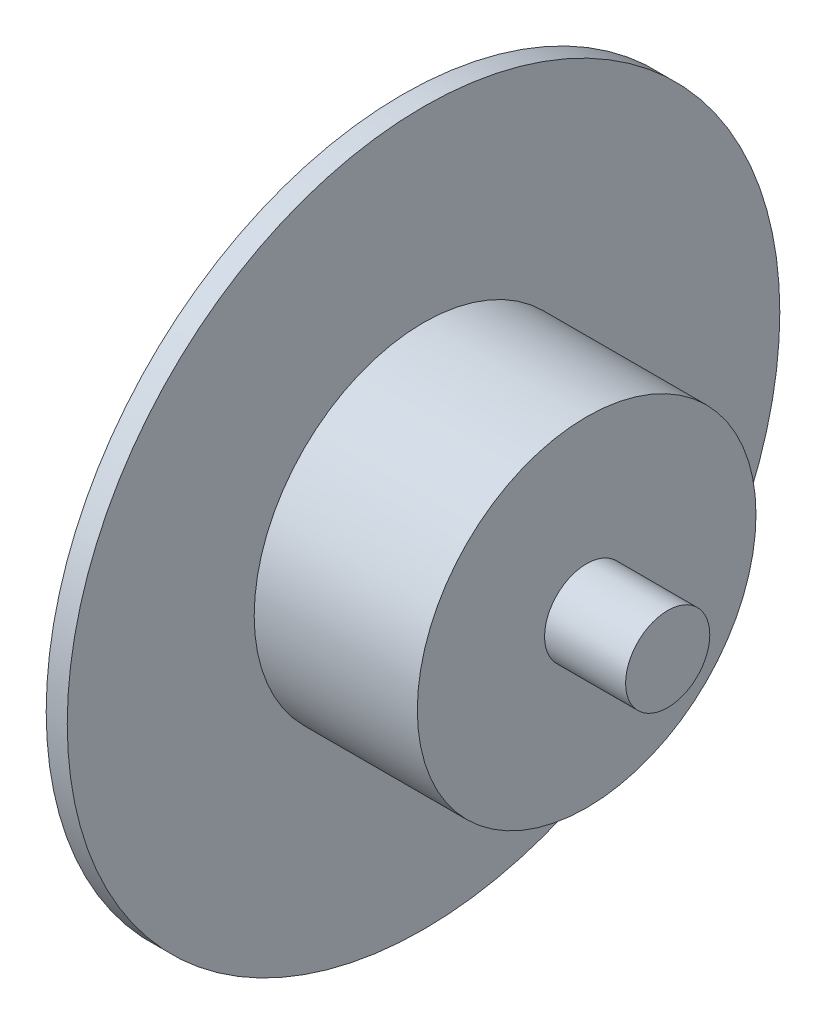
ISO-10303-21;
HEADER;
FILE_DESCRIPTION(('STEP AP214'),'2;1');
FILE_NAME('part.step','',(''),(''),'','','');
FILE_SCHEMA(('AUTOMOTIVE_DESIGN { 1 0 10303 214 1 1 1 1 }'));
ENDSEC;
DATA;
#1=APPLICATION_CONTEXT('core data for automotive mechanical design processes');
#2=APPLICATION_PROTOCOL_DEFINITION('international standard','automotive_design',2000,#1);
#3=PRODUCT_CONTEXT('',#1,'mechanical');
#4=PRODUCT('Part','Part','',(#3));
#5=PRODUCT_RELATED_PRODUCT_CATEGORY('part','',(#4));
#6=PRODUCT_DEFINITION_FORMATION('','',#4);
#7=PRODUCT_DEFINITION_CONTEXT('part definition',#1,'design');
#8=PRODUCT_DEFINITION('design','',#6,#7);
#9=PRODUCT_DEFINITION_SHAPE('','',#8);
#10=(LENGTH_UNIT() NAMED_UNIT(*) SI_UNIT(.MILLI.,.METRE.));
#11=(NAMED_UNIT(*) PLANE_ANGLE_UNIT() SI_UNIT($,.RADIAN.));
#12=(NAMED_UNIT(*) SI_UNIT($,.STERADIAN.) SOLID_ANGLE_UNIT());
#13=UNCERTAINTY_MEASURE_WITH_UNIT(LENGTH_MEASURE(1.E-05),#10,'distance_accuracy_value','');
#14=(GEOMETRIC_REPRESENTATION_CONTEXT(3) GLOBAL_UNCERTAINTY_ASSIGNED_CONTEXT((#13)) GLOBAL_UNIT_ASSIGNED_CONTEXT((#10,
#11,#12)) REPRESENTATION_CONTEXT('',''));
#15=CARTESIAN_POINT('',(0.,0.,0.));
#16=DIRECTION('',(0.,0.,1.));
#17=DIRECTION('',(1.,0.,0.));
#18=AXIS2_PLACEMENT_3D('',#15,#16,#17);
#19=CARTESIAN_POINT('',(-110.,0.,0.));
#20=DIRECTION('',(1.,0.,0.));
#21=DIRECTION('',(0.,0.,-1.));
#22=AXIS2_PLACEMENT_3D('',#19,#20,#21);
#23=CYLINDRICAL_SURFACE('',#22,169.268161275);
#24=CARTESIAN_POINT('',(-110.,0.,0.));
#25=DIRECTION('',(-1.,0.,0.));
#26=DIRECTION('',(0.,0.,1.));
#27=AXIS2_PLACEMENT_3D('',#24,#25,#26);
#28=CIRCLE('',#27,169.268161275);
#29=CARTESIAN_POINT('',(-110.,0.,169.268161275));
#30=VERTEX_POINT('',#29);
#31=EDGE_CURVE('E41',#30,#30,#28,.T.);
#32=ORIENTED_EDGE('',*,*,#31,.F.);
#33=EDGE_LOOP('',(#32));
#34=FACE_BOUND('',#33,.T.);
#35=CARTESIAN_POINT('',(-100.,0.,0.));
#36=DIRECTION('',(-1.,0.,0.));
#37=DIRECTION('',(0.,0.,1.));
#38=AXIS2_PLACEMENT_3D('',#35,#36,#37);
#39=CIRCLE('',#38,169.268161275);
#40=CARTESIAN_POINT('',(-100.,0.,169.268161275));
#41=VERTEX_POINT('',#40);
#42=EDGE_CURVE('E45',#41,#41,#39,.T.);
#43=ORIENTED_EDGE('',*,*,#42,.T.);
#44=EDGE_LOOP('',(#43));
#45=FACE_BOUND('',#44,.T.);
#46=ADVANCED_FACE('F31',(#34,#45),#23,.T.);
#47=CARTESIAN_POINT('',(-110.,0.,0.));
#48=DIRECTION('',(-1.,0.,0.));
#49=DIRECTION('',(0.,0.,1.));
#50=AXIS2_PLACEMENT_3D('',#47,#48,#49);
#51=PLANE('',#50);
#52=ORIENTED_EDGE('',*,*,#31,.T.);
#53=EDGE_LOOP('',(#52));
#54=FACE_BOUND('',#53,.T.);
#55=ADVANCED_FACE('F73',(#54),#51,.T.);
#56=CARTESIAN_POINT('',(-100.,0.,0.));
#57=DIRECTION('',(-1.,0.,0.));
#58=DIRECTION('',(0.,0.,1.));
#59=AXIS2_PLACEMENT_3D('',#56,#57,#58);
#60=PLANE('',#59);
#61=CARTESIAN_POINT('',(-100.,0.,0.));
#62=DIRECTION('',(-1.,0.,0.));
#63=DIRECTION('',(0.,0.,1.));
#64=AXIS2_PLACEMENT_3D('',#61,#62,#63);
#65=CIRCLE('',#64,80.450571876557);
#66=CARTESIAN_POINT('',(-100.,0.,80.450571876557));
#67=VERTEX_POINT('',#66);
#68=EDGE_CURVE('E10',#67,#67,#65,.F.);
#69=ORIENTED_EDGE('',*,*,#68,.F.);
#70=EDGE_LOOP('',(#69));
#71=FACE_BOUND('',#70,.T.);
#72=ORIENTED_EDGE('',*,*,#42,.F.);
#73=EDGE_LOOP('',(#72));
#74=FACE_BOUND('',#73,.T.);
#75=ADVANCED_FACE('F70',(#71,#74),#60,.F.);
#76=CARTESIAN_POINT('',(-151.154136957567,0.,0.));
#77=DIRECTION('',(-1.,0.,0.));
#78=DIRECTION('',(0.,0.,1.));
#79=AXIS2_PLACEMENT_3D('',#76,#77,#78);
#80=CYLINDRICAL_SURFACE('',#79,80.450571876557);
#81=ORIENTED_EDGE('',*,*,#68,.T.);
#82=EDGE_LOOP('',(#81));
#83=FACE_BOUND('',#82,.T.);
#84=CARTESIAN_POINT('',(-22.5,0.,0.));
#85=DIRECTION('',(-1.,0.,0.));
#86=DIRECTION('',(0.,0.,1.));
#87=AXIS2_PLACEMENT_3D('',#84,#85,#86);
#88=CIRCLE('',#87,80.450571876557);
#89=CARTESIAN_POINT('',(-22.5,0.,80.450571876557));
#90=VERTEX_POINT('',#89);
#91=EDGE_CURVE('E53',#90,#90,#88,.T.);
#92=ORIENTED_EDGE('',*,*,#91,.T.);
#93=EDGE_LOOP('',(#92));
#94=FACE_BOUND('',#93,.T.);
#95=ADVANCED_FACE('F57',(#83,#94),#80,.T.);
#96=CARTESIAN_POINT('',(-22.5,0.,-80.450571876557));
#97=DIRECTION('',(-1.,0.,0.));
#98=DIRECTION('',(0.,0.,1.));
#99=AXIS2_PLACEMENT_3D('',#96,#97,#98);
#100=PLANE('',#99);
#101=CARTESIAN_POINT('',(-22.5,0.,0.));
#102=DIRECTION('',(-1.,0.,0.));
#103=DIRECTION('',(0.,0.,1.));
#104=AXIS2_PLACEMENT_3D('',#101,#102,#103);
#105=CIRCLE('',#104,20.);
#106=CARTESIAN_POINT('',(-22.5,0.,20.));
#107=VERTEX_POINT('',#106);
#108=EDGE_CURVE('E37',#107,#107,#105,.T.);
#109=ORIENTED_EDGE('',*,*,#108,.T.);
#110=EDGE_LOOP('',(#109));
#111=FACE_BOUND('',#110,.T.);
#112=ORIENTED_EDGE('',*,*,#91,.F.);
#113=EDGE_LOOP('',(#112));
#114=FACE_BOUND('',#113,.T.);
#115=ADVANCED_FACE('F59',(#111,#114),#100,.F.);
#116=CARTESIAN_POINT('',(16.,0.,0.));
#117=DIRECTION('',(1.,0.,0.));
#118=DIRECTION('',(0.,0.,-1.));
#119=AXIS2_PLACEMENT_3D('',#116,#117,#118);
#120=PLANE('',#119);
#121=CARTESIAN_POINT('',(16.,0.,0.));
#122=DIRECTION('',(1.,0.,0.));
#123=DIRECTION('',(0.,0.,-1.));
#124=AXIS2_PLACEMENT_3D('',#121,#122,#123);
#125=CIRCLE('',#124,20.);
#126=CARTESIAN_POINT('',(16.,0.,-20.));
#127=VERTEX_POINT('',#126);
#128=EDGE_CURVE('E49',#127,#127,#125,.T.);
#129=ORIENTED_EDGE('',*,*,#128,.T.);
#130=EDGE_LOOP('',(#129));
#131=FACE_BOUND('',#130,.T.);
#132=ADVANCED_FACE('F61',(#131),#120,.T.);
#133=CARTESIAN_POINT('',(16.,0.,0.));
#134=DIRECTION('',(-1.,0.,0.));
#135=DIRECTION('',(0.,0.,1.));
#136=AXIS2_PLACEMENT_3D('',#133,#134,#135);
#137=CYLINDRICAL_SURFACE('',#136,20.);
#138=ORIENTED_EDGE('',*,*,#128,.F.);
#139=EDGE_LOOP('',(#138));
#140=FACE_BOUND('',#139,.T.);
#141=ORIENTED_EDGE('',*,*,#108,.F.);
#142=EDGE_LOOP('',(#141));
#143=FACE_BOUND('',#142,.T.);
#144=ADVANCED_FACE('F67',(#140,#143),#137,.T.);
#145=CLOSED_SHELL('',(#46,#55,#75,#95,#115,#132,#144));
#146=MANIFOLD_SOLID_BREP('B2',#145);
#147=ADVANCED_BREP_SHAPE_REPRESENTATION('',(#18,#146),#14);
#148=SHAPE_DEFINITION_REPRESENTATION(#9,#147);
ENDSEC;
END-ISO-10303-21;
